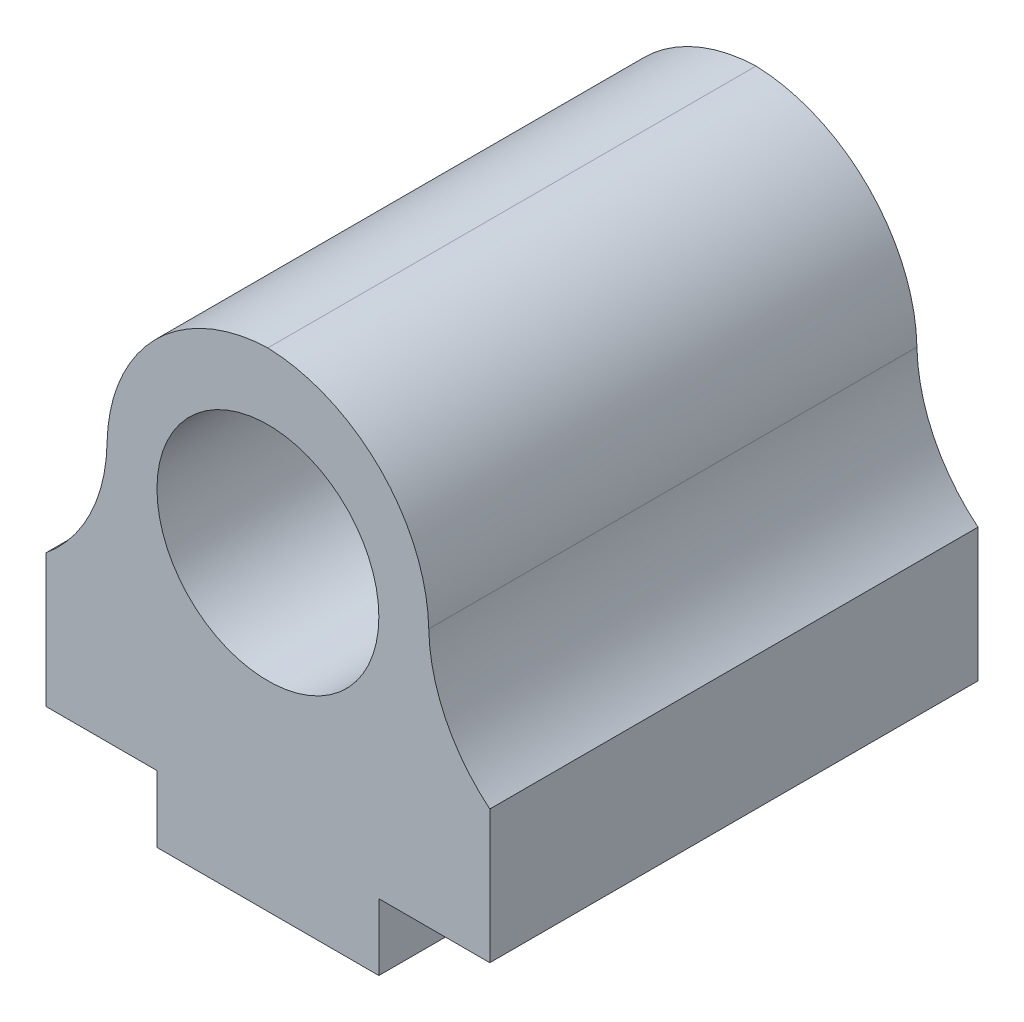
ISO-10303-21;
HEADER;
FILE_DESCRIPTION(('STEP AP214'),'2;1');
FILE_NAME('part.step','',(''),(''),'','','');
FILE_SCHEMA(('AUTOMOTIVE_DESIGN { 1 0 10303 214 1 1 1 1 }'));
ENDSEC;
DATA;
#1=APPLICATION_CONTEXT('core data for automotive mechanical design processes');
#2=APPLICATION_PROTOCOL_DEFINITION('international standard','automotive_design',2000,#1);
#3=PRODUCT_CONTEXT('',#1,'mechanical');
#4=PRODUCT('Part','Part','',(#3));
#5=PRODUCT_RELATED_PRODUCT_CATEGORY('part','',(#4));
#6=PRODUCT_DEFINITION_FORMATION('','',#4);
#7=PRODUCT_DEFINITION_CONTEXT('part definition',#1,'design');
#8=PRODUCT_DEFINITION('design','',#6,#7);
#9=PRODUCT_DEFINITION_SHAPE('','',#8);
#10=(LENGTH_UNIT() NAMED_UNIT(*) SI_UNIT(.MILLI.,.METRE.));
#11=(NAMED_UNIT(*) PLANE_ANGLE_UNIT() SI_UNIT($,.RADIAN.));
#12=(NAMED_UNIT(*) SI_UNIT($,.STERADIAN.) SOLID_ANGLE_UNIT());
#13=UNCERTAINTY_MEASURE_WITH_UNIT(LENGTH_MEASURE(1.E-05),#10,'distance_accuracy_value','');
#14=(GEOMETRIC_REPRESENTATION_CONTEXT(3) GLOBAL_UNCERTAINTY_ASSIGNED_CONTEXT((#13)) GLOBAL_UNIT_ASSIGNED_CONTEXT((#10,
#11,#12)) REPRESENTATION_CONTEXT('',''));
#15=CARTESIAN_POINT('',(0.,0.,0.));
#16=DIRECTION('',(0.,0.,1.));
#17=DIRECTION('',(1.,0.,0.));
#18=AXIS2_PLACEMENT_3D('',#15,#16,#17);
#19=CARTESIAN_POINT('',(0.,0.,0.));
#20=DIRECTION('',(0.,-1.,0.));
#21=DIRECTION('',(0.,0.,-1.));
#22=AXIS2_PLACEMENT_3D('',#19,#20,#21);
#23=PLANE('',#22);
#24=DIRECTION('',(0.,0.,-1.));
#25=VECTOR('',#24,1.);
#26=CARTESIAN_POINT('',(5.,0.,0.));
#27=LINE('',#26,#25);
#28=CARTESIAN_POINT('',(5.,0.,0.));
#29=VERTEX_POINT('',#28);
#30=CARTESIAN_POINT('',(5.,0.,-22.));
#31=VERTEX_POINT('',#30);
#32=EDGE_CURVE('E141',#29,#31,#27,.T.);
#33=ORIENTED_EDGE('',*,*,#32,.F.);
#34=DIRECTION('',(1.,0.,0.));
#35=VECTOR('',#34,1.);
#36=CARTESIAN_POINT('',(0.,0.,0.));
#37=LINE('',#36,#35);
#38=CARTESIAN_POINT('',(0.,0.,0.));
#39=VERTEX_POINT('',#38);
#40=EDGE_CURVE('E158',#39,#29,#37,.T.);
#41=ORIENTED_EDGE('',*,*,#40,.F.);
#42=DIRECTION('',(0.,0.,1.));
#43=VECTOR('',#42,1.);
#44=CARTESIAN_POINT('',(0.,0.,0.));
#45=LINE('',#44,#43);
#46=CARTESIAN_POINT('',(0.,0.,-22.));
#47=VERTEX_POINT('',#46);
#48=EDGE_CURVE('E142',#47,#39,#45,.T.);
#49=ORIENTED_EDGE('',*,*,#48,.F.);
#50=DIRECTION('',(-1.,0.,0.));
#51=VECTOR('',#50,1.);
#52=CARTESIAN_POINT('',(0.,0.,-22.));
#53=LINE('',#52,#51);
#54=EDGE_CURVE('E163',#31,#47,#53,.T.);
#55=ORIENTED_EDGE('',*,*,#54,.F.);
#56=EDGE_LOOP('',(#33,#41,#49,#55));
#57=FACE_BOUND('',#56,.T.);
#58=ADVANCED_FACE('F37',(#57),#23,.T.);
#59=CARTESIAN_POINT('',(0.,6.,0.));
#60=DIRECTION('',(1.,0.,0.));
#61=DIRECTION('',(0.,0.,-1.));
#62=AXIS2_PLACEMENT_3D('',#59,#60,#61);
#63=PLANE('',#62);
#64=ORIENTED_EDGE('',*,*,#48,.T.);
#65=DIRECTION('',(0.,-1.,0.));
#66=VECTOR('',#65,1.);
#67=CARTESIAN_POINT('',(0.,6.,0.));
#68=LINE('',#67,#66);
#69=CARTESIAN_POINT('',(0.,6.,0.));
#70=VERTEX_POINT('',#69);
#71=EDGE_CURVE('E173',#70,#39,#68,.T.);
#72=ORIENTED_EDGE('',*,*,#71,.F.);
#73=DIRECTION('',(0.,0.,1.));
#74=VECTOR('',#73,1.);
#75=CARTESIAN_POINT('',(0.,6.,0.));
#76=LINE('',#75,#74);
#77=CARTESIAN_POINT('',(0.,6.,-22.));
#78=VERTEX_POINT('',#77);
#79=EDGE_CURVE('E151',#78,#70,#76,.T.);
#80=ORIENTED_EDGE('',*,*,#79,.F.);
#81=DIRECTION('',(0.,-1.,0.));
#82=VECTOR('',#81,1.);
#83=CARTESIAN_POINT('',(0.,6.,-22.));
#84=LINE('',#83,#82);
#85=EDGE_CURVE('E156',#78,#47,#84,.T.);
#86=ORIENTED_EDGE('',*,*,#85,.T.);
#87=EDGE_LOOP('',(#64,#72,#80,#86));
#88=FACE_BOUND('',#87,.T.);
#89=ADVANCED_FACE('F204',(#88),#63,.F.);
#90=CARTESIAN_POINT('',(0.,6.,0.));
#91=DIRECTION('',(0.,0.,-1.));
#92=DIRECTION('',(-1.,0.,0.));
#93=AXIS2_PLACEMENT_3D('',#90,#91,#92);
#94=PLANE('',#93);
#95=CARTESIAN_POINT('',(10.,11.,0.));
#96=DIRECTION('',(0.,0.,1.));
#97=DIRECTION('',(1.,0.,0.));
#98=AXIS2_PLACEMENT_3D('',#95,#96,#97);
#99=CIRCLE('',#98,5.);
#100=CARTESIAN_POINT('',(15.,11.,0.));
#101=VERTEX_POINT('',#100);
#102=EDGE_CURVE('E190',#101,#101,#99,.T.);
#103=ORIENTED_EDGE('',*,*,#102,.F.);
#104=EDGE_LOOP('',(#103));
#105=FACE_BOUND('',#104,.T.);
#106=DIRECTION('',(0.,-1.,0.));
#107=VECTOR('',#106,1.);
#108=CARTESIAN_POINT('',(20.,6.,0.));
#109=LINE('',#108,#107);
#110=CARTESIAN_POINT('',(20.,6.,0.));
#111=VERTEX_POINT('',#110);
#112=CARTESIAN_POINT('',(20.,0.,0.));
#113=VERTEX_POINT('',#112);
#114=EDGE_CURVE('E170',#111,#113,#109,.T.);
#115=ORIENTED_EDGE('',*,*,#114,.F.);
#116=CARTESIAN_POINT('',(24.7468650433401,11.8066575807702,0.));
#117=DIRECTION('',(0.,0.,-1.));
#118=DIRECTION('',(-1.,0.,0.));
#119=AXIS2_PLACEMENT_3D('',#116,#117,#118);
#120=CIRCLE('',#119,7.5);
#121=CARTESIAN_POINT('',(17.2484325216701,11.6533287903851,0.));
#122=VERTEX_POINT('',#121);
#123=EDGE_CURVE('E197',#111,#122,#120,.T.);
#124=ORIENTED_EDGE('',*,*,#123,.T.);
#125=CARTESIAN_POINT('',(9.75000000000001,11.5,0.));
#126=DIRECTION('',(0.,0.,-1.));
#127=DIRECTION('',(-1.,0.,0.));
#128=AXIS2_PLACEMENT_3D('',#125,#126,#127);
#129=CIRCLE('',#128,7.5);
#130=CARTESIAN_POINT('',(10.,18.9958321752825,0.));
#131=VERTEX_POINT('',#130);
#132=EDGE_CURVE('E184',#122,#131,#129,.F.);
#133=ORIENTED_EDGE('',*,*,#132,.T.);
#134=CARTESIAN_POINT('',(10.25,11.5,0.));
#135=DIRECTION('',(0.,0.,-1.));
#136=DIRECTION('',(-1.,0.,0.));
#137=AXIS2_PLACEMENT_3D('',#134,#135,#136);
#138=CIRCLE('',#137,7.5);
#139=CARTESIAN_POINT('',(2.75156747832995,11.6533287903851,0.));
#140=VERTEX_POINT('',#139);
#141=EDGE_CURVE('E181',#131,#140,#138,.F.);
#142=ORIENTED_EDGE('',*,*,#141,.T.);
#143=CARTESIAN_POINT('',(-4.74686504334009,11.8066575807702,0.));
#144=DIRECTION('',(0.,0.,-1.));
#145=DIRECTION('',(-1.,0.,0.));
#146=AXIS2_PLACEMENT_3D('',#143,#144,#145);
#147=CIRCLE('',#146,7.5);
#148=EDGE_CURVE('E45',#140,#70,#147,.T.);
#149=ORIENTED_EDGE('',*,*,#148,.T.);
#150=ORIENTED_EDGE('',*,*,#71,.T.);
#151=ORIENTED_EDGE('',*,*,#40,.T.);
#152=DIRECTION('',(0.,1.,0.));
#153=VECTOR('',#152,1.);
#154=CARTESIAN_POINT('',(5.,-3.,0.));
#155=LINE('',#154,#153);
#156=CARTESIAN_POINT('',(5.,-3.,0.));
#157=VERTEX_POINT('',#156);
#158=EDGE_CURVE('E234',#157,#29,#155,.T.);
#159=ORIENTED_EDGE('',*,*,#158,.F.);
#160=DIRECTION('',(-1.,0.,0.));
#161=VECTOR('',#160,1.);
#162=CARTESIAN_POINT('',(5.,-3.,0.));
#163=LINE('',#162,#161);
#164=CARTESIAN_POINT('',(15.,-3.,0.));
#165=VERTEX_POINT('',#164);
#166=EDGE_CURVE('E134',#165,#157,#163,.T.);
#167=ORIENTED_EDGE('',*,*,#166,.F.);
#168=DIRECTION('',(0.,1.,0.));
#169=VECTOR('',#168,1.);
#170=CARTESIAN_POINT('',(15.,-3.,0.));
#171=LINE('',#170,#169);
#172=CARTESIAN_POINT('',(15.,0.,0.));
#173=VERTEX_POINT('',#172);
#174=EDGE_CURVE('E147',#165,#173,#171,.T.);
#175=ORIENTED_EDGE('',*,*,#174,.T.);
#176=EDGE_CURVE('E145',#173,#113,#37,.T.);
#177=ORIENTED_EDGE('',*,*,#176,.T.);
#178=EDGE_LOOP('',(#115,#124,#133,#142,#149,#150,#151,#159,#167,#175,#177));
#179=FACE_BOUND('',#178,.T.);
#180=ADVANCED_FACE('F200',(#105,#179),#94,.F.);
#181=CARTESIAN_POINT('',(20.,6.,0.));
#182=DIRECTION('',(-1.,0.,0.));
#183=DIRECTION('',(0.,0.,1.));
#184=AXIS2_PLACEMENT_3D('',#181,#182,#183);
#185=PLANE('',#184);
#186=DIRECTION('',(0.,0.,-1.));
#187=VECTOR('',#186,1.);
#188=CARTESIAN_POINT('',(20.,0.,0.));
#189=LINE('',#188,#187);
#190=CARTESIAN_POINT('',(20.,0.,-22.));
#191=VERTEX_POINT('',#190);
#192=EDGE_CURVE('E161',#113,#191,#189,.T.);
#193=ORIENTED_EDGE('',*,*,#192,.T.);
#194=DIRECTION('',(0.,-1.,0.));
#195=VECTOR('',#194,1.);
#196=CARTESIAN_POINT('',(20.,6.,-22.));
#197=LINE('',#196,#195);
#198=CARTESIAN_POINT('',(20.,6.,-22.));
#199=VERTEX_POINT('',#198);
#200=EDGE_CURVE('E167',#199,#191,#197,.T.);
#201=ORIENTED_EDGE('',*,*,#200,.F.);
#202=DIRECTION('',(0.,0.,-1.));
#203=VECTOR('',#202,1.);
#204=CARTESIAN_POINT('',(20.,6.,0.));
#205=LINE('',#204,#203);
#206=EDGE_CURVE('E153',#111,#199,#205,.T.);
#207=ORIENTED_EDGE('',*,*,#206,.F.);
#208=ORIENTED_EDGE('',*,*,#114,.T.);
#209=EDGE_LOOP('',(#193,#201,#207,#208));
#210=FACE_BOUND('',#209,.T.);
#211=ADVANCED_FACE('F220',(#210),#185,.F.);
#212=CARTESIAN_POINT('',(0.,6.,-22.));
#213=DIRECTION('',(0.,0.,1.));
#214=DIRECTION('',(1.,0.,0.));
#215=AXIS2_PLACEMENT_3D('',#212,#213,#214);
#216=PLANE('',#215);
#217=CARTESIAN_POINT('',(10.,11.,-22.));
#218=DIRECTION('',(0.,0.,1.));
#219=DIRECTION('',(1.,0.,0.));
#220=AXIS2_PLACEMENT_3D('',#217,#218,#219);
#221=CIRCLE('',#220,5.);
#222=CARTESIAN_POINT('',(15.,11.,-22.));
#223=VERTEX_POINT('',#222);
#224=EDGE_CURVE('E230',#223,#223,#221,.T.);
#225=ORIENTED_EDGE('',*,*,#224,.T.);
#226=EDGE_LOOP('',(#225));
#227=FACE_BOUND('',#226,.T.);
#228=ORIENTED_EDGE('',*,*,#85,.F.);
#229=CARTESIAN_POINT('',(-4.7468650433401,11.8066575807702,-22.));
#230=DIRECTION('',(0.,0.,1.));
#231=DIRECTION('',(1.,0.,0.));
#232=AXIS2_PLACEMENT_3D('',#229,#230,#231);
#233=CIRCLE('',#232,7.5);
#234=CARTESIAN_POINT('',(2.75156747832995,11.6533287903851,-22.));
#235=VERTEX_POINT('',#234);
#236=EDGE_CURVE('E11',#78,#235,#233,.T.);
#237=ORIENTED_EDGE('',*,*,#236,.T.);
#238=CARTESIAN_POINT('',(10.25,11.5,-22.));
#239=DIRECTION('',(0.,0.,1.));
#240=DIRECTION('',(1.,0.,0.));
#241=AXIS2_PLACEMENT_3D('',#238,#239,#240);
#242=CIRCLE('',#241,7.5);
#243=CARTESIAN_POINT('',(10.,18.9958321752825,-22.));
#244=VERTEX_POINT('',#243);
#245=EDGE_CURVE('E176',#235,#244,#242,.F.);
#246=ORIENTED_EDGE('',*,*,#245,.T.);
#247=CARTESIAN_POINT('',(9.75,11.5,-22.));
#248=DIRECTION('',(0.,0.,1.));
#249=DIRECTION('',(1.,0.,0.));
#250=AXIS2_PLACEMENT_3D('',#247,#248,#249);
#251=CIRCLE('',#250,7.5);
#252=CARTESIAN_POINT('',(17.24843252167,11.6533287903851,-22.));
#253=VERTEX_POINT('',#252);
#254=EDGE_CURVE('E178',#244,#253,#251,.F.);
#255=ORIENTED_EDGE('',*,*,#254,.T.);
#256=CARTESIAN_POINT('',(24.7468650433401,11.8066575807702,-22.));
#257=DIRECTION('',(0.,0.,1.));
#258=DIRECTION('',(1.,0.,0.));
#259=AXIS2_PLACEMENT_3D('',#256,#257,#258);
#260=CIRCLE('',#259,7.5);
#261=EDGE_CURVE('E195',#253,#199,#260,.T.);
#262=ORIENTED_EDGE('',*,*,#261,.T.);
#263=ORIENTED_EDGE('',*,*,#200,.T.);
#264=CARTESIAN_POINT('',(15.,0.,-22.));
#265=VERTEX_POINT('',#264);
#266=EDGE_CURVE('E154',#191,#265,#53,.T.);
#267=ORIENTED_EDGE('',*,*,#266,.T.);
#268=DIRECTION('',(0.,1.,0.));
#269=VECTOR('',#268,1.);
#270=CARTESIAN_POINT('',(15.,-3.,-22.));
#271=LINE('',#270,#269);
#272=CARTESIAN_POINT('',(15.,-3.,-22.));
#273=VERTEX_POINT('',#272);
#274=EDGE_CURVE('E125',#273,#265,#271,.T.);
#275=ORIENTED_EDGE('',*,*,#274,.F.);
#276=DIRECTION('',(1.,0.,0.));
#277=VECTOR('',#276,1.);
#278=CARTESIAN_POINT('',(5.,-3.,-22.));
#279=LINE('',#278,#277);
#280=CARTESIAN_POINT('',(5.,-3.,-22.));
#281=VERTEX_POINT('',#280);
#282=EDGE_CURVE('E117',#281,#273,#279,.T.);
#283=ORIENTED_EDGE('',*,*,#282,.F.);
#284=DIRECTION('',(0.,1.,0.));
#285=VECTOR('',#284,1.);
#286=CARTESIAN_POINT('',(5.,-3.,-22.));
#287=LINE('',#286,#285);
#288=EDGE_CURVE('E121',#281,#31,#287,.T.);
#289=ORIENTED_EDGE('',*,*,#288,.T.);
#290=ORIENTED_EDGE('',*,*,#54,.T.);
#291=EDGE_LOOP('',(#228,#237,#246,#255,#262,#263,#267,#275,#283,#289,#290));
#292=FACE_BOUND('',#291,.T.);
#293=ADVANCED_FACE('F119',(#227,#292),#216,.F.);
#294=DIRECTION('',(0.,0.,1.));
#295=VECTOR('',#294,1.);
#296=CARTESIAN_POINT('',(15.,0.,0.));
#297=LINE('',#296,#295);
#298=EDGE_CURVE('E138',#265,#173,#297,.T.);
#299=ORIENTED_EDGE('',*,*,#298,.F.);
#300=ORIENTED_EDGE('',*,*,#266,.F.);
#301=ORIENTED_EDGE('',*,*,#192,.F.);
#302=ORIENTED_EDGE('',*,*,#176,.F.);
#303=EDGE_LOOP('',(#299,#300,#301,#302));
#304=FACE_BOUND('',#303,.T.);
#305=ADVANCED_FACE('F224',(#304),#23,.T.);
#306=CARTESIAN_POINT('',(5.,-3.,0.));
#307=DIRECTION('',(1.,0.,0.));
#308=DIRECTION('',(0.,0.,-1.));
#309=AXIS2_PLACEMENT_3D('',#306,#307,#308);
#310=PLANE('',#309);
#311=ORIENTED_EDGE('',*,*,#32,.T.);
#312=ORIENTED_EDGE('',*,*,#288,.F.);
#313=DIRECTION('',(0.,0.,-1.));
#314=VECTOR('',#313,1.);
#315=CARTESIAN_POINT('',(5.,-3.,0.));
#316=LINE('',#315,#314);
#317=EDGE_CURVE('E129',#157,#281,#316,.T.);
#318=ORIENTED_EDGE('',*,*,#317,.F.);
#319=ORIENTED_EDGE('',*,*,#158,.T.);
#320=EDGE_LOOP('',(#311,#312,#318,#319));
#321=FACE_BOUND('',#320,.T.);
#322=ADVANCED_FACE('F140',(#321),#310,.F.);
#323=CARTESIAN_POINT('',(15.,-3.,0.));
#324=DIRECTION('',(-1.,0.,0.));
#325=DIRECTION('',(0.,0.,1.));
#326=AXIS2_PLACEMENT_3D('',#323,#324,#325);
#327=PLANE('',#326);
#328=ORIENTED_EDGE('',*,*,#298,.T.);
#329=ORIENTED_EDGE('',*,*,#174,.F.);
#330=DIRECTION('',(0.,0.,1.));
#331=VECTOR('',#330,1.);
#332=CARTESIAN_POINT('',(15.,-3.,0.));
#333=LINE('',#332,#331);
#334=EDGE_CURVE('E128',#273,#165,#333,.T.);
#335=ORIENTED_EDGE('',*,*,#334,.F.);
#336=ORIENTED_EDGE('',*,*,#274,.T.);
#337=EDGE_LOOP('',(#328,#329,#335,#336));
#338=FACE_BOUND('',#337,.T.);
#339=ADVANCED_FACE('F235',(#338),#327,.F.);
#340=CARTESIAN_POINT('',(0.,-3.,0.));
#341=DIRECTION('',(0.,-1.,0.));
#342=DIRECTION('',(0.,0.,-1.));
#343=AXIS2_PLACEMENT_3D('',#340,#341,#342);
#344=PLANE('',#343);
#345=ORIENTED_EDGE('',*,*,#317,.T.);
#346=ORIENTED_EDGE('',*,*,#282,.T.);
#347=ORIENTED_EDGE('',*,*,#334,.T.);
#348=ORIENTED_EDGE('',*,*,#166,.T.);
#349=EDGE_LOOP('',(#345,#346,#347,#348));
#350=FACE_BOUND('',#349,.T.);
#351=ADVANCED_FACE('F132',(#350),#344,.T.);
#352=CARTESIAN_POINT('',(10.,11.,-22.));
#353=DIRECTION('',(0.,0.,1.));
#354=DIRECTION('',(1.,0.,0.));
#355=AXIS2_PLACEMENT_3D('',#352,#353,#354);
#356=CYLINDRICAL_SURFACE('',#355,5.);
#357=ORIENTED_EDGE('',*,*,#224,.F.);
#358=EDGE_LOOP('',(#357));
#359=FACE_BOUND('',#358,.T.);
#360=ORIENTED_EDGE('',*,*,#102,.T.);
#361=EDGE_LOOP('',(#360));
#362=FACE_BOUND('',#361,.T.);
#363=ADVANCED_FACE('F244',(#359,#362),#356,.F.);
#364=CARTESIAN_POINT('',(10.25,11.5,0.));
#365=DIRECTION('',(0.,0.,-1.));
#366=DIRECTION('',(-1.,0.,0.));
#367=AXIS2_PLACEMENT_3D('',#364,#365,#366);
#368=CYLINDRICAL_SURFACE('',#367,7.5);
#369=ORIENTED_EDGE('',*,*,#245,.F.);
#370=DIRECTION('',(0.,0.,-1.));
#371=VECTOR('',#370,1.);
#372=CARTESIAN_POINT('',(2.75156747832995,11.6533287903851,0.));
#373=LINE('',#372,#371);
#374=EDGE_CURVE('E193',#235,#140,#373,.F.);
#375=ORIENTED_EDGE('',*,*,#374,.T.);
#376=ORIENTED_EDGE('',*,*,#141,.F.);
#377=DIRECTION('',(0.,0.,-1.));
#378=VECTOR('',#377,1.);
#379=CARTESIAN_POINT('',(10.,18.9958321752825,-11.));
#380=LINE('',#379,#378);
#381=EDGE_CURVE('E187',#244,#131,#380,.F.);
#382=ORIENTED_EDGE('',*,*,#381,.F.);
#383=EDGE_LOOP('',(#369,#375,#376,#382));
#384=FACE_BOUND('',#383,.T.);
#385=ADVANCED_FACE('F207',(#384),#368,.T.);
#386=CARTESIAN_POINT('',(9.75000000000001,11.5,0.));
#387=DIRECTION('',(0.,0.,1.));
#388=DIRECTION('',(1.,0.,0.));
#389=AXIS2_PLACEMENT_3D('',#386,#387,#388);
#390=CYLINDRICAL_SURFACE('',#389,7.5);
#391=ORIENTED_EDGE('',*,*,#132,.F.);
#392=DIRECTION('',(0.,0.,1.));
#393=VECTOR('',#392,1.);
#394=CARTESIAN_POINT('',(17.2484325216701,11.6533287903851,0.));
#395=LINE('',#394,#393);
#396=EDGE_CURVE('E186',#122,#253,#395,.F.);
#397=ORIENTED_EDGE('',*,*,#396,.T.);
#398=ORIENTED_EDGE('',*,*,#254,.F.);
#399=ORIENTED_EDGE('',*,*,#381,.T.);
#400=EDGE_LOOP('',(#391,#397,#398,#399));
#401=FACE_BOUND('',#400,.T.);
#402=ADVANCED_FACE('F213',(#401),#390,.T.);
#403=CARTESIAN_POINT('',(24.7468650433401,11.8066575807702,0.));
#404=DIRECTION('',(0.,0.,1.));
#405=DIRECTION('',(1.,0.,0.));
#406=AXIS2_PLACEMENT_3D('',#403,#404,#405);
#407=CYLINDRICAL_SURFACE('',#406,7.5);
#408=ORIENTED_EDGE('',*,*,#123,.F.);
#409=ORIENTED_EDGE('',*,*,#206,.T.);
#410=ORIENTED_EDGE('',*,*,#261,.F.);
#411=ORIENTED_EDGE('',*,*,#396,.F.);
#412=EDGE_LOOP('',(#408,#409,#410,#411));
#413=FACE_BOUND('',#412,.T.);
#414=ADVANCED_FACE('F217',(#413),#407,.F.);
#415=CARTESIAN_POINT('',(-4.74686504334009,11.8066575807702,0.));
#416=DIRECTION('',(0.,0.,-1.));
#417=DIRECTION('',(-1.,0.,0.));
#418=AXIS2_PLACEMENT_3D('',#415,#416,#417);
#419=CYLINDRICAL_SURFACE('',#418,7.5);
#420=ORIENTED_EDGE('',*,*,#236,.F.);
#421=ORIENTED_EDGE('',*,*,#79,.T.);
#422=ORIENTED_EDGE('',*,*,#148,.F.);
#423=ORIENTED_EDGE('',*,*,#374,.F.);
#424=EDGE_LOOP('',(#420,#421,#422,#423));
#425=FACE_BOUND('',#424,.T.);
#426=ADVANCED_FACE('F39',(#425),#419,.F.);
#427=CLOSED_SHELL('',(#58,#89,#180,#211,#293,#305,#322,#339,#351,#363,#385,#402,#414,#426));
#428=MANIFOLD_SOLID_BREP('B2',#427);
#429=ADVANCED_BREP_SHAPE_REPRESENTATION('',(#18,#428),#14);
#430=SHAPE_DEFINITION_REPRESENTATION(#9,#429);
ENDSEC;
END-ISO-10303-21;
